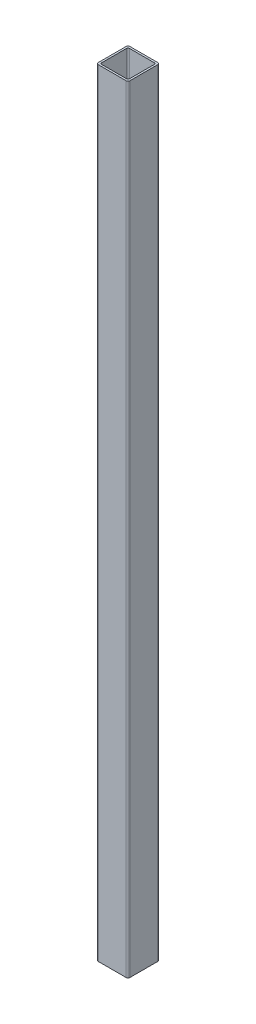
ISO-10303-21;
HEADER;
FILE_DESCRIPTION(('STEP AP214'),'2;1');
FILE_NAME('part.step','',(''),(''),'','','');
FILE_SCHEMA(('AUTOMOTIVE_DESIGN { 1 0 10303 214 1 1 1 1 }'));
ENDSEC;
DATA;
#1=APPLICATION_CONTEXT('core data for automotive mechanical design processes');
#2=APPLICATION_PROTOCOL_DEFINITION('international standard','automotive_design',2000,#1);
#3=PRODUCT_CONTEXT('',#1,'mechanical');
#4=PRODUCT('Part','Part','',(#3));
#5=PRODUCT_RELATED_PRODUCT_CATEGORY('part','',(#4));
#6=PRODUCT_DEFINITION_FORMATION('','',#4);
#7=PRODUCT_DEFINITION_CONTEXT('part definition',#1,'design');
#8=PRODUCT_DEFINITION('design','',#6,#7);
#9=PRODUCT_DEFINITION_SHAPE('','',#8);
#10=(LENGTH_UNIT() NAMED_UNIT(*) SI_UNIT(.MILLI.,.METRE.));
#11=(NAMED_UNIT(*) PLANE_ANGLE_UNIT() SI_UNIT($,.RADIAN.));
#12=(NAMED_UNIT(*) SI_UNIT($,.STERADIAN.) SOLID_ANGLE_UNIT());
#13=UNCERTAINTY_MEASURE_WITH_UNIT(LENGTH_MEASURE(1.E-05),#10,'distance_accuracy_value','');
#14=(GEOMETRIC_REPRESENTATION_CONTEXT(3) GLOBAL_UNCERTAINTY_ASSIGNED_CONTEXT((#13)) GLOBAL_UNIT_ASSIGNED_CONTEXT((#10,
#11,#12)) REPRESENTATION_CONTEXT('',''));
#15=CARTESIAN_POINT('',(0.,0.,0.));
#16=DIRECTION('',(0.,0.,1.));
#17=DIRECTION('',(1.,0.,0.));
#18=AXIS2_PLACEMENT_3D('',#15,#16,#17);
#19=CARTESIAN_POINT('',(0.,2601.42135623731,6.00000000000006));
#20=DIRECTION('',(1.,0.,0.));
#21=DIRECTION('',(0.,0.,-1.));
#22=AXIS2_PLACEMENT_3D('',#19,#20,#21);
#23=PLANE('',#22);
#24=DIRECTION('',(0.,0.,1.));
#25=VECTOR('',#24,1.);
#26=CARTESIAN_POINT('',(0.,2460.,6.00000000000006));
#27=LINE('',#26,#25);
#28=CARTESIAN_POINT('',(0.,2460.,6.00000000000006));
#29=VERTEX_POINT('',#28);
#30=CARTESIAN_POINT('',(0.,2460.,94.));
#31=VERTEX_POINT('',#30);
#32=EDGE_CURVE('E305',#29,#31,#27,.T.);
#33=ORIENTED_EDGE('',*,*,#32,.F.);
#34=DIRECTION('',(0.,-1.,0.));
#35=VECTOR('',#34,1.);
#36=CARTESIAN_POINT('',(0.,2601.42135623731,6.00000000000006));
#37=LINE('',#36,#35);
#38=CARTESIAN_POINT('',(0.,0.,6.00000000000006));
#39=VERTEX_POINT('',#38);
#40=EDGE_CURVE('E49',#29,#39,#37,.T.);
#41=ORIENTED_EDGE('',*,*,#40,.T.);
#42=DIRECTION('',(0.,0.,1.));
#43=VECTOR('',#42,1.);
#44=CARTESIAN_POINT('',(0.,0.,6.00000000000006));
#45=LINE('',#44,#43);
#46=CARTESIAN_POINT('',(0.,0.,94.));
#47=VERTEX_POINT('',#46);
#48=EDGE_CURVE('E200',#39,#47,#45,.T.);
#49=ORIENTED_EDGE('',*,*,#48,.T.);
#50=DIRECTION('',(0.,-1.,0.));
#51=VECTOR('',#50,1.);
#52=CARTESIAN_POINT('',(0.,2601.42135623731,94.));
#53=LINE('',#52,#51);
#54=EDGE_CURVE('E203',#31,#47,#53,.T.);
#55=ORIENTED_EDGE('',*,*,#54,.F.);
#56=EDGE_LOOP('',(#33,#41,#49,#55));
#57=FACE_BOUND('',#56,.T.);
#58=ADVANCED_FACE('F34',(#57),#23,.F.);
#59=CARTESIAN_POINT('',(6.00000000000023,2601.42135623731,6.00000000000006));
#60=DIRECTION('',(0.,-1.,0.));
#61=DIRECTION('',(0.,0.,-1.));
#62=AXIS2_PLACEMENT_3D('',#59,#60,#61);
#63=CYLINDRICAL_SURFACE('',#62,6.00000000000014);
#64=CARTESIAN_POINT('',(6.00000000000023,2460.,6.00000000000006));
#65=DIRECTION('',(0.,1.,0.));
#66=DIRECTION('',(0.,0.,1.));
#67=AXIS2_PLACEMENT_3D('',#64,#65,#66);
#68=CIRCLE('',#67,6.00000000000014);
#69=CARTESIAN_POINT('',(6.00000000000023,2460.,0.));
#70=VERTEX_POINT('',#69);
#71=EDGE_CURVE('E241',#70,#29,#68,.T.);
#72=ORIENTED_EDGE('',*,*,#71,.F.);
#73=DIRECTION('',(0.,-1.,0.));
#74=VECTOR('',#73,1.);
#75=CARTESIAN_POINT('',(6.00000000000023,2601.42135623731,0.));
#76=LINE('',#75,#74);
#77=CARTESIAN_POINT('',(6.00000000000023,0.,0.));
#78=VERTEX_POINT('',#77);
#79=EDGE_CURVE('E206',#70,#78,#76,.T.);
#80=ORIENTED_EDGE('',*,*,#79,.T.);
#81=CARTESIAN_POINT('',(6.00000000000023,0.,6.00000000000006));
#82=DIRECTION('',(0.,1.,0.));
#83=DIRECTION('',(0.,0.,1.));
#84=AXIS2_PLACEMENT_3D('',#81,#82,#83);
#85=CIRCLE('',#84,6.00000000000014);
#86=EDGE_CURVE('E198',#78,#39,#85,.T.);
#87=ORIENTED_EDGE('',*,*,#86,.T.);
#88=ORIENTED_EDGE('',*,*,#40,.F.);
#89=EDGE_LOOP('',(#72,#80,#87,#88));
#90=FACE_BOUND('',#89,.T.);
#91=ADVANCED_FACE('F238',(#90),#63,.T.);
#92=CARTESIAN_POINT('',(6.00000000000023,2601.42135623731,0.));
#93=DIRECTION('',(0.,0.,1.));
#94=DIRECTION('',(1.,0.,0.));
#95=AXIS2_PLACEMENT_3D('',#92,#93,#94);
#96=PLANE('',#95);
#97=DIRECTION('',(-1.,0.,0.));
#98=VECTOR('',#97,1.);
#99=CARTESIAN_POINT('',(6.00000000000023,2460.,0.));
#100=LINE('',#99,#98);
#101=CARTESIAN_POINT('',(93.9999999999994,2460.,0.));
#102=VERTEX_POINT('',#101);
#103=EDGE_CURVE('E246',#102,#70,#100,.T.);
#104=ORIENTED_EDGE('',*,*,#103,.F.);
#105=DIRECTION('',(0.,-1.,0.));
#106=VECTOR('',#105,1.);
#107=CARTESIAN_POINT('',(93.9999999999994,2601.42135623731,0.));
#108=LINE('',#107,#106);
#109=CARTESIAN_POINT('',(93.9999999999994,0.,0.));
#110=VERTEX_POINT('',#109);
#111=EDGE_CURVE('E208',#102,#110,#108,.T.);
#112=ORIENTED_EDGE('',*,*,#111,.T.);
#113=DIRECTION('',(-1.,0.,0.));
#114=VECTOR('',#113,1.);
#115=CARTESIAN_POINT('',(6.00000000000023,0.,0.));
#116=LINE('',#115,#114);
#117=EDGE_CURVE('E195',#110,#78,#116,.T.);
#118=ORIENTED_EDGE('',*,*,#117,.T.);
#119=ORIENTED_EDGE('',*,*,#79,.F.);
#120=EDGE_LOOP('',(#104,#112,#118,#119));
#121=FACE_BOUND('',#120,.T.);
#122=ADVANCED_FACE('F244',(#121),#96,.F.);
#123=CARTESIAN_POINT('',(93.9999999999994,2601.42135623731,6.00000000000006));
#124=DIRECTION('',(0.,-1.,0.));
#125=DIRECTION('',(0.,0.,-1.));
#126=AXIS2_PLACEMENT_3D('',#123,#124,#125);
#127=CYLINDRICAL_SURFACE('',#126,6.00000000000014);
#128=CARTESIAN_POINT('',(93.9999999999994,2460.,6.00000000000006));
#129=DIRECTION('',(0.,1.,0.));
#130=DIRECTION('',(0.,0.,1.));
#131=AXIS2_PLACEMENT_3D('',#128,#129,#130);
#132=CIRCLE('',#131,6.00000000000014);
#133=CARTESIAN_POINT('',(99.9999999999996,2460.,6.00000000000006));
#134=VERTEX_POINT('',#133);
#135=EDGE_CURVE('E309',#134,#102,#132,.T.);
#136=ORIENTED_EDGE('',*,*,#135,.F.);
#137=DIRECTION('',(0.,-1.,0.));
#138=VECTOR('',#137,1.);
#139=CARTESIAN_POINT('',(99.9999999999996,2601.42135623731,6.00000000000006));
#140=LINE('',#139,#138);
#141=CARTESIAN_POINT('',(99.9999999999996,0.,6.00000000000006));
#142=VERTEX_POINT('',#141);
#143=EDGE_CURVE('E210',#134,#142,#140,.T.);
#144=ORIENTED_EDGE('',*,*,#143,.T.);
#145=CARTESIAN_POINT('',(93.9999999999994,0.,6.00000000000006));
#146=DIRECTION('',(0.,1.,0.));
#147=DIRECTION('',(0.,0.,-1.));
#148=AXIS2_PLACEMENT_3D('',#145,#146,#147);
#149=CIRCLE('',#148,6.00000000000014);
#150=EDGE_CURVE('E192',#142,#110,#149,.T.);
#151=ORIENTED_EDGE('',*,*,#150,.T.);
#152=ORIENTED_EDGE('',*,*,#111,.F.);
#153=EDGE_LOOP('',(#136,#144,#151,#152));
#154=FACE_BOUND('',#153,.T.);
#155=ADVANCED_FACE('F249',(#154),#127,.T.);
#156=CARTESIAN_POINT('',(99.9999999999996,2601.42135623731,6.00000000000006));
#157=DIRECTION('',(-1.,0.,0.));
#158=DIRECTION('',(0.,0.,1.));
#159=AXIS2_PLACEMENT_3D('',#156,#157,#158);
#160=PLANE('',#159);
#161=DIRECTION('',(0.,0.,-1.));
#162=VECTOR('',#161,1.);
#163=CARTESIAN_POINT('',(99.9999999999996,2460.,6.00000000000006));
#164=LINE('',#163,#162);
#165=CARTESIAN_POINT('',(99.9999999999996,2460.,94.));
#166=VERTEX_POINT('',#165);
#167=EDGE_CURVE('E255',#166,#134,#164,.T.);
#168=ORIENTED_EDGE('',*,*,#167,.F.);
#169=DIRECTION('',(0.,-1.,0.));
#170=VECTOR('',#169,1.);
#171=CARTESIAN_POINT('',(99.9999999999996,2601.42135623731,94.));
#172=LINE('',#171,#170);
#173=CARTESIAN_POINT('',(99.9999999999996,0.,94.));
#174=VERTEX_POINT('',#173);
#175=EDGE_CURVE('E212',#166,#174,#172,.T.);
#176=ORIENTED_EDGE('',*,*,#175,.T.);
#177=DIRECTION('',(0.,0.,-1.));
#178=VECTOR('',#177,1.);
#179=CARTESIAN_POINT('',(99.9999999999996,0.,6.00000000000006));
#180=LINE('',#179,#178);
#181=EDGE_CURVE('E189',#174,#142,#180,.T.);
#182=ORIENTED_EDGE('',*,*,#181,.T.);
#183=ORIENTED_EDGE('',*,*,#143,.F.);
#184=EDGE_LOOP('',(#168,#176,#182,#183));
#185=FACE_BOUND('',#184,.T.);
#186=ADVANCED_FACE('F252',(#185),#160,.F.);
#187=CARTESIAN_POINT('',(93.9999999999994,2601.42135623731,94.));
#188=DIRECTION('',(0.,-1.,0.));
#189=DIRECTION('',(0.,0.,-1.));
#190=AXIS2_PLACEMENT_3D('',#187,#188,#189);
#191=CYLINDRICAL_SURFACE('',#190,6.00000000000014);
#192=CARTESIAN_POINT('',(93.9999999999994,2460.,94.));
#193=DIRECTION('',(0.,1.,0.));
#194=DIRECTION('',(0.,0.,1.));
#195=AXIS2_PLACEMENT_3D('',#192,#193,#194);
#196=CIRCLE('',#195,6.00000000000014);
#197=CARTESIAN_POINT('',(93.9999999999994,2460.,100.));
#198=VERTEX_POINT('',#197);
#199=EDGE_CURVE('E259',#198,#166,#196,.T.);
#200=ORIENTED_EDGE('',*,*,#199,.F.);
#201=DIRECTION('',(0.,-1.,0.));
#202=VECTOR('',#201,1.);
#203=CARTESIAN_POINT('',(93.9999999999994,2601.42135623731,100.));
#204=LINE('',#203,#202);
#205=CARTESIAN_POINT('',(93.9999999999994,0.,100.));
#206=VERTEX_POINT('',#205);
#207=EDGE_CURVE('E214',#198,#206,#204,.T.);
#208=ORIENTED_EDGE('',*,*,#207,.T.);
#209=CARTESIAN_POINT('',(93.9999999999994,0.,94.));
#210=DIRECTION('',(0.,1.,0.));
#211=DIRECTION('',(0.,0.,1.));
#212=AXIS2_PLACEMENT_3D('',#209,#210,#211);
#213=CIRCLE('',#212,6.00000000000014);
#214=EDGE_CURVE('E186',#206,#174,#213,.T.);
#215=ORIENTED_EDGE('',*,*,#214,.T.);
#216=ORIENTED_EDGE('',*,*,#175,.F.);
#217=EDGE_LOOP('',(#200,#208,#215,#216));
#218=FACE_BOUND('',#217,.T.);
#219=ADVANCED_FACE('F258',(#218),#191,.T.);
#220=CARTESIAN_POINT('',(6.00000000000023,2601.42135623731,100.));
#221=DIRECTION('',(0.,0.,-1.));
#222=DIRECTION('',(-1.,0.,0.));
#223=AXIS2_PLACEMENT_3D('',#220,#221,#222);
#224=PLANE('',#223);
#225=DIRECTION('',(1.,0.,0.));
#226=VECTOR('',#225,1.);
#227=CARTESIAN_POINT('',(6.00000000000023,2460.,100.));
#228=LINE('',#227,#226);
#229=CARTESIAN_POINT('',(6.00000000000023,2460.,100.));
#230=VERTEX_POINT('',#229);
#231=EDGE_CURVE('E222',#230,#198,#228,.T.);
#232=ORIENTED_EDGE('',*,*,#231,.F.);
#233=DIRECTION('',(0.,-1.,0.));
#234=VECTOR('',#233,1.);
#235=CARTESIAN_POINT('',(6.00000000000023,2601.42135623731,100.));
#236=LINE('',#235,#234);
#237=CARTESIAN_POINT('',(6.00000000000023,0.,100.));
#238=VERTEX_POINT('',#237);
#239=EDGE_CURVE('E42',#230,#238,#236,.T.);
#240=ORIENTED_EDGE('',*,*,#239,.T.);
#241=DIRECTION('',(1.,0.,0.));
#242=VECTOR('',#241,1.);
#243=CARTESIAN_POINT('',(6.00000000000023,0.,100.));
#244=LINE('',#243,#242);
#245=EDGE_CURVE('E183',#238,#206,#244,.T.);
#246=ORIENTED_EDGE('',*,*,#245,.T.);
#247=ORIENTED_EDGE('',*,*,#207,.F.);
#248=EDGE_LOOP('',(#232,#240,#246,#247));
#249=FACE_BOUND('',#248,.T.);
#250=ADVANCED_FACE('F218',(#249),#224,.F.);
#251=CARTESIAN_POINT('',(6.00000000000023,2601.42135623731,94.));
#252=DIRECTION('',(0.,-1.,0.));
#253=DIRECTION('',(0.,0.,-1.));
#254=AXIS2_PLACEMENT_3D('',#251,#252,#253);
#255=CYLINDRICAL_SURFACE('',#254,6.00000000000014);
#256=CARTESIAN_POINT('',(6.00000000000023,2460.,94.));
#257=DIRECTION('',(0.,1.,0.));
#258=DIRECTION('',(0.,0.,1.));
#259=AXIS2_PLACEMENT_3D('',#256,#257,#258);
#260=CIRCLE('',#259,6.00000000000014);
#261=EDGE_CURVE('E232',#31,#230,#260,.T.);
#262=ORIENTED_EDGE('',*,*,#261,.F.);
#263=ORIENTED_EDGE('',*,*,#54,.T.);
#264=CARTESIAN_POINT('',(6.00000000000023,0.,94.));
#265=DIRECTION('',(0.,1.,0.));
#266=DIRECTION('',(0.,0.,1.));
#267=AXIS2_PLACEMENT_3D('',#264,#265,#266);
#268=CIRCLE('',#267,6.00000000000014);
#269=EDGE_CURVE('E180',#47,#238,#268,.T.);
#270=ORIENTED_EDGE('',*,*,#269,.T.);
#271=ORIENTED_EDGE('',*,*,#239,.F.);
#272=EDGE_LOOP('',(#262,#263,#270,#271));
#273=FACE_BOUND('',#272,.T.);
#274=ADVANCED_FACE('F36',(#273),#255,.T.);
#275=CARTESIAN_POINT('',(6.00000000000023,0.,94.));
#276=DIRECTION('',(0.,1.,0.));
#277=DIRECTION('',(0.,0.,1.));
#278=AXIS2_PLACEMENT_3D('',#275,#276,#277);
#279=PLANE('',#278);
#280=ORIENTED_EDGE('',*,*,#269,.F.);
#281=ORIENTED_EDGE('',*,*,#48,.F.);
#282=ORIENTED_EDGE('',*,*,#86,.F.);
#283=ORIENTED_EDGE('',*,*,#117,.F.);
#284=ORIENTED_EDGE('',*,*,#150,.F.);
#285=ORIENTED_EDGE('',*,*,#181,.F.);
#286=ORIENTED_EDGE('',*,*,#214,.F.);
#287=ORIENTED_EDGE('',*,*,#245,.F.);
#288=EDGE_LOOP('',(#280,#281,#282,#283,#284,#285,#286,#287));
#289=FACE_BOUND('',#288,.T.);
#290=CARTESIAN_POINT('',(9.9999999999989,0.,90.));
#291=DIRECTION('',(0.,1.,0.));
#292=DIRECTION('',(0.,0.,1.));
#293=AXIS2_PLACEMENT_3D('',#290,#291,#292);
#294=CIRCLE('',#293,3.99999999999978);
#295=CARTESIAN_POINT('',(5.99999999999934,0.,90.));
#296=VERTEX_POINT('',#295);
#297=CARTESIAN_POINT('',(9.9999999999989,0.,94.));
#298=VERTEX_POINT('',#297);
#299=EDGE_CURVE('E261',#296,#298,#294,.T.);
#300=ORIENTED_EDGE('',*,*,#299,.T.);
#301=DIRECTION('',(1.,0.,0.));
#302=VECTOR('',#301,1.);
#303=CARTESIAN_POINT('',(9.9999999999989,0.,94.));
#304=LINE('',#303,#302);
#305=CARTESIAN_POINT('',(90.0000000000007,0.,93.9999999999998));
#306=VERTEX_POINT('',#305);
#307=EDGE_CURVE('E268',#298,#306,#304,.T.);
#308=ORIENTED_EDGE('',*,*,#307,.T.);
#309=CARTESIAN_POINT('',(90.0000000000007,0.,90.));
#310=DIRECTION('',(0.,1.,0.));
#311=DIRECTION('',(0.,0.,1.));
#312=AXIS2_PLACEMENT_3D('',#309,#310,#311);
#313=CIRCLE('',#312,3.99999999999978);
#314=CARTESIAN_POINT('',(94.0000000000003,0.,90.));
#315=VERTEX_POINT('',#314);
#316=EDGE_CURVE('E271',#306,#315,#313,.T.);
#317=ORIENTED_EDGE('',*,*,#316,.T.);
#318=DIRECTION('',(0.,0.,-1.));
#319=VECTOR('',#318,1.);
#320=CARTESIAN_POINT('',(94.0000000000003,0.,10.0000000000001));
#321=LINE('',#320,#319);
#322=CARTESIAN_POINT('',(94.0000000000005,0.,10.0000000000001));
#323=VERTEX_POINT('',#322);
#324=EDGE_CURVE('E274',#315,#323,#321,.T.);
#325=ORIENTED_EDGE('',*,*,#324,.T.);
#326=CARTESIAN_POINT('',(90.0000000000007,0.,10.0000000000001));
#327=DIRECTION('',(0.,1.,0.));
#328=DIRECTION('',(0.,0.,-1.));
#329=AXIS2_PLACEMENT_3D('',#326,#327,#328);
#330=CIRCLE('',#329,3.99999999999978);
#331=CARTESIAN_POINT('',(90.0000000000007,0.,6.00000000000006));
#332=VERTEX_POINT('',#331);
#333=EDGE_CURVE('E277',#323,#332,#330,.T.);
#334=ORIENTED_EDGE('',*,*,#333,.T.);
#335=DIRECTION('',(-1.,0.,0.));
#336=VECTOR('',#335,1.);
#337=CARTESIAN_POINT('',(9.9999999999989,0.,6.00000000000006));
#338=LINE('',#337,#336);
#339=CARTESIAN_POINT('',(9.9999999999989,0.,6.00000000000028));
#340=VERTEX_POINT('',#339);
#341=EDGE_CURVE('E280',#332,#340,#338,.T.);
#342=ORIENTED_EDGE('',*,*,#341,.T.);
#343=CARTESIAN_POINT('',(9.9999999999989,0.,10.0000000000001));
#344=DIRECTION('',(0.,1.,0.));
#345=DIRECTION('',(0.,0.,1.));
#346=AXIS2_PLACEMENT_3D('',#343,#344,#345);
#347=CIRCLE('',#346,3.99999999999978);
#348=CARTESIAN_POINT('',(5.99999999999934,0.,10.0000000000001));
#349=VERTEX_POINT('',#348);
#350=EDGE_CURVE('E283',#340,#349,#347,.T.);
#351=ORIENTED_EDGE('',*,*,#350,.T.);
#352=DIRECTION('',(0.,0.,1.));
#353=VECTOR('',#352,1.);
#354=CARTESIAN_POINT('',(5.99999999999934,0.,10.0000000000001));
#355=LINE('',#354,#353);
#356=EDGE_CURVE('E162',#349,#296,#355,.T.);
#357=ORIENTED_EDGE('',*,*,#356,.T.);
#358=EDGE_LOOP('',(#300,#308,#317,#325,#334,#342,#351,#357));
#359=FACE_BOUND('',#358,.T.);
#360=ADVANCED_FACE('F228',(#289,#359),#279,.F.);
#361=CARTESIAN_POINT('',(5.99999999999934,2601.42135623731,10.0000000000001));
#362=DIRECTION('',(1.,0.,0.));
#363=DIRECTION('',(0.,0.,-1.));
#364=AXIS2_PLACEMENT_3D('',#361,#362,#363);
#365=PLANE('',#364);
#366=DIRECTION('',(0.,-1.,0.));
#367=VECTOR('',#366,1.);
#368=CARTESIAN_POINT('',(5.99999999999934,2601.42135623731,10.0000000000001));
#369=LINE('',#368,#367);
#370=CARTESIAN_POINT('',(5.99999999999934,2460.,10.0000000000001));
#371=VERTEX_POINT('',#370);
#372=EDGE_CURVE('E154',#371,#349,#369,.T.);
#373=ORIENTED_EDGE('',*,*,#372,.F.);
#374=DIRECTION('',(0.,0.,1.));
#375=VECTOR('',#374,1.);
#376=CARTESIAN_POINT('',(5.99999999999934,2460.,10.0000000000001));
#377=LINE('',#376,#375);
#378=CARTESIAN_POINT('',(5.99999999999934,2460.,90.));
#379=VERTEX_POINT('',#378);
#380=EDGE_CURVE('E11',#371,#379,#377,.T.);
#381=ORIENTED_EDGE('',*,*,#380,.T.);
#382=DIRECTION('',(0.,-1.,0.));
#383=VECTOR('',#382,1.);
#384=CARTESIAN_POINT('',(5.99999999999934,2601.42135623731,90.));
#385=LINE('',#384,#383);
#386=EDGE_CURVE('E164',#379,#296,#385,.T.);
#387=ORIENTED_EDGE('',*,*,#386,.T.);
#388=ORIENTED_EDGE('',*,*,#356,.F.);
#389=EDGE_LOOP('',(#373,#381,#387,#388));
#390=FACE_BOUND('',#389,.T.);
#391=ADVANCED_FACE('F160',(#390),#365,.T.);
#392=CARTESIAN_POINT('',(9.9999999999989,2601.42135623731,10.0000000000001));
#393=DIRECTION('',(0.,-1.,0.));
#394=DIRECTION('',(0.,0.,-1.));
#395=AXIS2_PLACEMENT_3D('',#392,#393,#394);
#396=CYLINDRICAL_SURFACE('',#395,3.99999999999978);
#397=DIRECTION('',(0.,-1.,0.));
#398=VECTOR('',#397,1.);
#399=CARTESIAN_POINT('',(9.9999999999989,2601.42135623731,6.00000000000028));
#400=LINE('',#399,#398);
#401=CARTESIAN_POINT('',(9.9999999999989,2460.,6.00000000000028));
#402=VERTEX_POINT('',#401);
#403=EDGE_CURVE('E156',#402,#340,#400,.T.);
#404=ORIENTED_EDGE('',*,*,#403,.F.);
#405=CARTESIAN_POINT('',(9.9999999999989,2460.,10.0000000000001));
#406=DIRECTION('',(0.,1.,0.));
#407=DIRECTION('',(0.,0.,1.));
#408=AXIS2_PLACEMENT_3D('',#405,#406,#407);
#409=CIRCLE('',#408,3.99999999999978);
#410=EDGE_CURVE('E147',#402,#371,#409,.T.);
#411=ORIENTED_EDGE('',*,*,#410,.T.);
#412=ORIENTED_EDGE('',*,*,#372,.T.);
#413=ORIENTED_EDGE('',*,*,#350,.F.);
#414=EDGE_LOOP('',(#404,#411,#412,#413));
#415=FACE_BOUND('',#414,.T.);
#416=ADVANCED_FACE('F152',(#415),#396,.F.);
#417=CARTESIAN_POINT('',(9.9999999999989,2601.42135623731,6.00000000000006));
#418=DIRECTION('',(0.,0.,1.));
#419=DIRECTION('',(1.,0.,0.));
#420=AXIS2_PLACEMENT_3D('',#417,#418,#419);
#421=PLANE('',#420);
#422=DIRECTION('',(0.,-1.,0.));
#423=VECTOR('',#422,1.);
#424=CARTESIAN_POINT('',(90.0000000000007,2601.42135623731,6.00000000000006));
#425=LINE('',#424,#423);
#426=CARTESIAN_POINT('',(90.0000000000007,2460.,6.00000000000006));
#427=VERTEX_POINT('',#426);
#428=EDGE_CURVE('E166',#427,#332,#425,.T.);
#429=ORIENTED_EDGE('',*,*,#428,.F.);
#430=DIRECTION('',(-1.,0.,0.));
#431=VECTOR('',#430,1.);
#432=CARTESIAN_POINT('',(9.9999999999989,2460.,6.00000000000006));
#433=LINE('',#432,#431);
#434=EDGE_CURVE('E158',#427,#402,#433,.T.);
#435=ORIENTED_EDGE('',*,*,#434,.T.);
#436=ORIENTED_EDGE('',*,*,#403,.T.);
#437=ORIENTED_EDGE('',*,*,#341,.F.);
#438=EDGE_LOOP('',(#429,#435,#436,#437));
#439=FACE_BOUND('',#438,.T.);
#440=ADVANCED_FACE('F289',(#439),#421,.T.);
#441=CARTESIAN_POINT('',(90.0000000000007,2601.42135623731,10.0000000000001));
#442=DIRECTION('',(0.,-1.,0.));
#443=DIRECTION('',(0.,0.,-1.));
#444=AXIS2_PLACEMENT_3D('',#441,#442,#443);
#445=CYLINDRICAL_SURFACE('',#444,3.99999999999978);
#446=DIRECTION('',(0.,-1.,0.));
#447=VECTOR('',#446,1.);
#448=CARTESIAN_POINT('',(94.0000000000005,2601.42135623731,10.0000000000001));
#449=LINE('',#448,#447);
#450=CARTESIAN_POINT('',(94.0000000000005,2460.,10.0000000000001));
#451=VERTEX_POINT('',#450);
#452=EDGE_CURVE('E172',#451,#323,#449,.T.);
#453=ORIENTED_EDGE('',*,*,#452,.F.);
#454=CARTESIAN_POINT('',(90.0000000000007,2460.,10.0000000000001));
#455=DIRECTION('',(0.,1.,0.));
#456=DIRECTION('',(0.,0.,1.));
#457=AXIS2_PLACEMENT_3D('',#454,#455,#456);
#458=CIRCLE('',#457,3.99999999999978);
#459=EDGE_CURVE('E291',#451,#427,#458,.T.);
#460=ORIENTED_EDGE('',*,*,#459,.T.);
#461=ORIENTED_EDGE('',*,*,#428,.T.);
#462=ORIENTED_EDGE('',*,*,#333,.F.);
#463=EDGE_LOOP('',(#453,#460,#461,#462));
#464=FACE_BOUND('',#463,.T.);
#465=ADVANCED_FACE('F326',(#464),#445,.F.);
#466=CARTESIAN_POINT('',(94.0000000000003,2601.42135623731,10.0000000000001));
#467=DIRECTION('',(-1.,0.,0.));
#468=DIRECTION('',(0.,0.,1.));
#469=AXIS2_PLACEMENT_3D('',#466,#467,#468);
#470=PLANE('',#469);
#471=DIRECTION('',(0.,-1.,0.));
#472=VECTOR('',#471,1.);
#473=CARTESIAN_POINT('',(94.0000000000003,2601.42135623731,90.));
#474=LINE('',#473,#472);
#475=CARTESIAN_POINT('',(94.0000000000003,2460.,90.));
#476=VERTEX_POINT('',#475);
#477=EDGE_CURVE('E174',#476,#315,#474,.T.);
#478=ORIENTED_EDGE('',*,*,#477,.F.);
#479=DIRECTION('',(0.,0.,-1.));
#480=VECTOR('',#479,1.);
#481=CARTESIAN_POINT('',(94.0000000000003,2460.,10.0000000000001));
#482=LINE('',#481,#480);
#483=EDGE_CURVE('E293',#476,#451,#482,.T.);
#484=ORIENTED_EDGE('',*,*,#483,.T.);
#485=ORIENTED_EDGE('',*,*,#452,.T.);
#486=ORIENTED_EDGE('',*,*,#324,.F.);
#487=EDGE_LOOP('',(#478,#484,#485,#486));
#488=FACE_BOUND('',#487,.T.);
#489=ADVANCED_FACE('F323',(#488),#470,.T.);
#490=CARTESIAN_POINT('',(90.0000000000007,2601.42135623731,90.));
#491=DIRECTION('',(0.,-1.,0.));
#492=DIRECTION('',(0.,0.,-1.));
#493=AXIS2_PLACEMENT_3D('',#490,#491,#492);
#494=CYLINDRICAL_SURFACE('',#493,3.99999999999978);
#495=DIRECTION('',(0.,-1.,0.));
#496=VECTOR('',#495,1.);
#497=CARTESIAN_POINT('',(90.0000000000007,2601.42135623731,93.9999999999998));
#498=LINE('',#497,#496);
#499=CARTESIAN_POINT('',(90.0000000000007,2460.,93.9999999999998));
#500=VERTEX_POINT('',#499);
#501=EDGE_CURVE('E176',#500,#306,#498,.T.);
#502=ORIENTED_EDGE('',*,*,#501,.F.);
#503=CARTESIAN_POINT('',(90.0000000000007,2460.,90.));
#504=DIRECTION('',(0.,1.,0.));
#505=DIRECTION('',(0.,0.,1.));
#506=AXIS2_PLACEMENT_3D('',#503,#504,#505);
#507=CIRCLE('',#506,3.99999999999978);
#508=EDGE_CURVE('E298',#500,#476,#507,.T.);
#509=ORIENTED_EDGE('',*,*,#508,.T.);
#510=ORIENTED_EDGE('',*,*,#477,.T.);
#511=ORIENTED_EDGE('',*,*,#316,.F.);
#512=EDGE_LOOP('',(#502,#509,#510,#511));
#513=FACE_BOUND('',#512,.T.);
#514=ADVANCED_FACE('F320',(#513),#494,.F.);
#515=CARTESIAN_POINT('',(9.9999999999989,2601.42135623731,94.));
#516=DIRECTION('',(0.,0.,-1.));
#517=DIRECTION('',(-1.,0.,0.));
#518=AXIS2_PLACEMENT_3D('',#515,#516,#517);
#519=PLANE('',#518);
#520=DIRECTION('',(0.,-1.,0.));
#521=VECTOR('',#520,1.);
#522=CARTESIAN_POINT('',(9.9999999999989,2601.42135623731,94.));
#523=LINE('',#522,#521);
#524=CARTESIAN_POINT('',(9.9999999999989,2460.,94.));
#525=VERTEX_POINT('',#524);
#526=EDGE_CURVE('E178',#525,#298,#523,.T.);
#527=ORIENTED_EDGE('',*,*,#526,.F.);
#528=DIRECTION('',(1.,0.,0.));
#529=VECTOR('',#528,1.);
#530=CARTESIAN_POINT('',(9.9999999999989,2460.,94.));
#531=LINE('',#530,#529);
#532=EDGE_CURVE('E301',#525,#500,#531,.T.);
#533=ORIENTED_EDGE('',*,*,#532,.T.);
#534=ORIENTED_EDGE('',*,*,#501,.T.);
#535=ORIENTED_EDGE('',*,*,#307,.F.);
#536=EDGE_LOOP('',(#527,#533,#534,#535));
#537=FACE_BOUND('',#536,.T.);
#538=ADVANCED_FACE('F315',(#537),#519,.T.);
#539=CARTESIAN_POINT('',(9.9999999999989,2601.42135623731,90.));
#540=DIRECTION('',(0.,-1.,0.));
#541=DIRECTION('',(0.,0.,-1.));
#542=AXIS2_PLACEMENT_3D('',#539,#540,#541);
#543=CYLINDRICAL_SURFACE('',#542,3.99999999999978);
#544=ORIENTED_EDGE('',*,*,#386,.F.);
#545=CARTESIAN_POINT('',(9.9999999999989,2460.,90.));
#546=DIRECTION('',(0.,1.,0.));
#547=DIRECTION('',(0.,0.,1.));
#548=AXIS2_PLACEMENT_3D('',#545,#546,#547);
#549=CIRCLE('',#548,3.99999999999978);
#550=EDGE_CURVE('E57',#379,#525,#549,.T.);
#551=ORIENTED_EDGE('',*,*,#550,.T.);
#552=ORIENTED_EDGE('',*,*,#526,.T.);
#553=ORIENTED_EDGE('',*,*,#299,.F.);
#554=EDGE_LOOP('',(#544,#551,#552,#553));
#555=FACE_BOUND('',#554,.T.);
#556=ADVANCED_FACE('F311',(#555),#543,.F.);
#557=CARTESIAN_POINT('',(0.,2460.,6.00000000000023));
#558=DIRECTION('',(0.,1.,0.));
#559=DIRECTION('',(0.,0.,1.));
#560=AXIS2_PLACEMENT_3D('',#557,#558,#559);
#561=PLANE('',#560);
#562=ORIENTED_EDGE('',*,*,#550,.F.);
#563=ORIENTED_EDGE('',*,*,#380,.F.);
#564=ORIENTED_EDGE('',*,*,#410,.F.);
#565=ORIENTED_EDGE('',*,*,#434,.F.);
#566=ORIENTED_EDGE('',*,*,#459,.F.);
#567=ORIENTED_EDGE('',*,*,#483,.F.);
#568=ORIENTED_EDGE('',*,*,#508,.F.);
#569=ORIENTED_EDGE('',*,*,#532,.F.);
#570=EDGE_LOOP('',(#562,#563,#564,#565,#566,#567,#568,#569));
#571=FACE_BOUND('',#570,.T.);
#572=ORIENTED_EDGE('',*,*,#32,.T.);
#573=ORIENTED_EDGE('',*,*,#261,.T.);
#574=ORIENTED_EDGE('',*,*,#231,.T.);
#575=ORIENTED_EDGE('',*,*,#199,.T.);
#576=ORIENTED_EDGE('',*,*,#167,.T.);
#577=ORIENTED_EDGE('',*,*,#135,.T.);
#578=ORIENTED_EDGE('',*,*,#103,.T.);
#579=ORIENTED_EDGE('',*,*,#71,.T.);
#580=EDGE_LOOP('',(#572,#573,#574,#575,#576,#577,#578,#579));
#581=FACE_BOUND('',#580,.T.);
#582=ADVANCED_FACE('F145',(#571,#581),#561,.T.);
#583=CLOSED_SHELL('',(#58,#91,#122,#155,#186,#219,#250,#274,#360,#391,#416,#440,#465,#489,#514,
#538,#556,#582));
#584=MANIFOLD_SOLID_BREP('B2',#583);
#585=ADVANCED_BREP_SHAPE_REPRESENTATION('',(#18,#584),#14);
#586=SHAPE_DEFINITION_REPRESENTATION(#9,#585);
ENDSEC;
END-ISO-10303-21;
